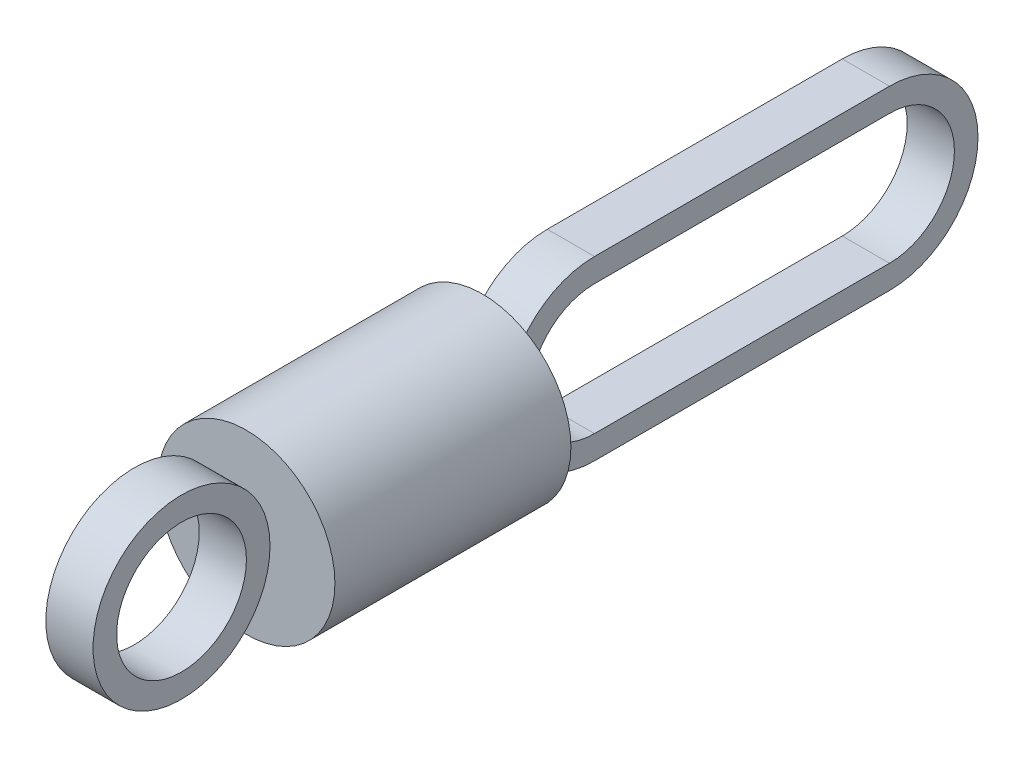
ISO-10303-21;
HEADER;
FILE_DESCRIPTION(('STEP AP214'),'2;1');
FILE_NAME('part.step','',(''),(''),'','','');
FILE_SCHEMA(('AUTOMOTIVE_DESIGN { 1 0 10303 214 1 1 1 1 }'));
ENDSEC;
DATA;
#1=APPLICATION_CONTEXT('core data for automotive mechanical design processes');
#2=APPLICATION_PROTOCOL_DEFINITION('international standard','automotive_design',2000,#1);
#3=PRODUCT_CONTEXT('',#1,'mechanical');
#4=PRODUCT('Part','Part','',(#3));
#5=PRODUCT_RELATED_PRODUCT_CATEGORY('part','',(#4));
#6=PRODUCT_DEFINITION_FORMATION('','',#4);
#7=PRODUCT_DEFINITION_CONTEXT('part definition',#1,'design');
#8=PRODUCT_DEFINITION('design','',#6,#7);
#9=PRODUCT_DEFINITION_SHAPE('','',#8);
#10=(LENGTH_UNIT() NAMED_UNIT(*) SI_UNIT(.MILLI.,.METRE.));
#11=(NAMED_UNIT(*) PLANE_ANGLE_UNIT() SI_UNIT($,.RADIAN.));
#12=(NAMED_UNIT(*) SI_UNIT($,.STERADIAN.) SOLID_ANGLE_UNIT());
#13=UNCERTAINTY_MEASURE_WITH_UNIT(LENGTH_MEASURE(1.E-05),#10,'distance_accuracy_value','');
#14=(GEOMETRIC_REPRESENTATION_CONTEXT(3) GLOBAL_UNCERTAINTY_ASSIGNED_CONTEXT((#13)) GLOBAL_UNIT_ASSIGNED_CONTEXT((#10,
#11,#12)) REPRESENTATION_CONTEXT('',''));
#15=CARTESIAN_POINT('',(0.,0.,0.));
#16=DIRECTION('',(0.,0.,1.));
#17=DIRECTION('',(1.,0.,0.));
#18=AXIS2_PLACEMENT_3D('',#15,#16,#17);
#19=CARTESIAN_POINT('',(0.,0.,-11.));
#20=DIRECTION('',(0.,0.,1.));
#21=DIRECTION('',(1.,0.,0.));
#22=AXIS2_PLACEMENT_3D('',#19,#20,#21);
#23=CYLINDRICAL_SURFACE('',#22,3.);
#24=CARTESIAN_POINT('',(0.,0.,-11.));
#25=DIRECTION('',(0.,0.,1.));
#26=DIRECTION('',(1.,0.,0.));
#27=AXIS2_PLACEMENT_3D('',#24,#25,#26);
#28=CIRCLE('',#27,3.);
#29=CARTESIAN_POINT('',(3.,0.,-11.));
#30=VERTEX_POINT('',#29);
#31=EDGE_CURVE('E11',#30,#30,#28,.T.);
#32=ORIENTED_EDGE('',*,*,#31,.T.);
#33=EDGE_LOOP('',(#32));
#34=FACE_BOUND('',#33,.T.);
#35=CARTESIAN_POINT('',(0.,0.,-3.));
#36=DIRECTION('',(0.,0.,1.));
#37=DIRECTION('',(1.,0.,0.));
#38=AXIS2_PLACEMENT_3D('',#35,#36,#37);
#39=CIRCLE('',#38,3.);
#40=CARTESIAN_POINT('',(3.,0.,-3.));
#41=VERTEX_POINT('',#40);
#42=EDGE_CURVE('E46',#41,#41,#39,.T.);
#43=ORIENTED_EDGE('',*,*,#42,.F.);
#44=EDGE_LOOP('',(#43));
#45=FACE_BOUND('',#44,.T.);
#46=ADVANCED_FACE('F43',(#34,#45),#23,.T.);
#47=CARTESIAN_POINT('',(0.,0.,-11.));
#48=DIRECTION('',(0.,0.,1.));
#49=DIRECTION('',(1.,0.,0.));
#50=AXIS2_PLACEMENT_3D('',#47,#48,#49);
#51=PLANE('',#50);
#52=ORIENTED_EDGE('',*,*,#31,.F.);
#53=EDGE_LOOP('',(#52));
#54=FACE_BOUND('',#53,.T.);
#55=ADVANCED_FACE('F58',(#54),#51,.F.);
#56=CARTESIAN_POINT('',(0.,0.,-3.));
#57=DIRECTION('',(0.,0.,1.));
#58=DIRECTION('',(1.,0.,0.));
#59=AXIS2_PLACEMENT_3D('',#56,#57,#58);
#60=PLANE('',#59);
#61=ORIENTED_EDGE('',*,*,#42,.T.);
#62=EDGE_LOOP('',(#61));
#63=FACE_BOUND('',#62,.T.);
#64=ADVANCED_FACE('F55',(#63),#60,.T.);
#65=CLOSED_SHELL('',(#46,#55,#64));
#66=MANIFOLD_SOLID_BREP('B2',#65);
#67=CARTESIAN_POINT('',(-0.8,0.,-24.));
#68=DIRECTION('',(1.,0.,0.));
#69=DIRECTION('',(0.,0.,-1.));
#70=AXIS2_PLACEMENT_3D('',#67,#68,#69);
#71=CYLINDRICAL_SURFACE('',#70,3.);
#72=DIRECTION('',(1.,0.,0.));
#73=VECTOR('',#72,1.);
#74=CARTESIAN_POINT('',(-0.8,3.,-24.));
#75=LINE('',#74,#73);
#76=CARTESIAN_POINT('',(-0.8,3.,-24.));
#77=VERTEX_POINT('',#76);
#78=CARTESIAN_POINT('',(0.8,3.,-24.));
#79=VERTEX_POINT('',#78);
#80=EDGE_CURVE('E94',#77,#79,#75,.T.);
#81=ORIENTED_EDGE('',*,*,#80,.T.);
#82=CARTESIAN_POINT('',(0.8,0.,-24.));
#83=DIRECTION('',(1.,0.,0.));
#84=DIRECTION('',(0.,0.,-1.));
#85=AXIS2_PLACEMENT_3D('',#82,#83,#84);
#86=CIRCLE('',#85,3.);
#87=CARTESIAN_POINT('',(0.8,-3.,-24.));
#88=VERTEX_POINT('',#87);
#89=EDGE_CURVE('E170',#88,#79,#86,.T.);
#90=ORIENTED_EDGE('',*,*,#89,.F.);
#91=DIRECTION('',(1.,0.,0.));
#92=VECTOR('',#91,1.);
#93=CARTESIAN_POINT('',(-0.8,-3.,-24.));
#94=LINE('',#93,#92);
#95=CARTESIAN_POINT('',(-0.8,-3.,-24.));
#96=VERTEX_POINT('',#95);
#97=EDGE_CURVE('E41',#96,#88,#94,.T.);
#98=ORIENTED_EDGE('',*,*,#97,.F.);
#99=CARTESIAN_POINT('',(-0.8,0.,-24.));
#100=DIRECTION('',(1.,0.,0.));
#101=DIRECTION('',(0.,0.,-1.));
#102=AXIS2_PLACEMENT_3D('',#99,#100,#101);
#103=CIRCLE('',#102,3.);
#104=EDGE_CURVE('E203',#96,#77,#103,.T.);
#105=ORIENTED_EDGE('',*,*,#104,.T.);
#106=EDGE_LOOP('',(#81,#90,#98,#105));
#107=FACE_BOUND('',#106,.T.);
#108=ADVANCED_FACE('F91',(#107),#71,.T.);
#109=CARTESIAN_POINT('',(-0.8,-3.,-24.));
#110=DIRECTION('',(0.,-1.,0.));
#111=DIRECTION('',(0.,0.,-1.));
#112=AXIS2_PLACEMENT_3D('',#109,#110,#111);
#113=PLANE('',#112);
#114=ORIENTED_EDGE('',*,*,#97,.T.);
#115=DIRECTION('',(0.,0.,-1.));
#116=VECTOR('',#115,1.);
#117=CARTESIAN_POINT('',(0.8,-3.,-24.));
#118=LINE('',#117,#116);
#119=CARTESIAN_POINT('',(0.8,-3.,-14.));
#120=VERTEX_POINT('',#119);
#121=EDGE_CURVE('E200',#120,#88,#118,.T.);
#122=ORIENTED_EDGE('',*,*,#121,.F.);
#123=DIRECTION('',(1.,0.,0.));
#124=VECTOR('',#123,1.);
#125=CARTESIAN_POINT('',(-0.8,-3.,-14.));
#126=LINE('',#125,#124);
#127=CARTESIAN_POINT('',(-0.8,-3.,-14.));
#128=VERTEX_POINT('',#127);
#129=EDGE_CURVE('E99',#128,#120,#126,.T.);
#130=ORIENTED_EDGE('',*,*,#129,.F.);
#131=DIRECTION('',(0.,0.,-1.));
#132=VECTOR('',#131,1.);
#133=CARTESIAN_POINT('',(-0.8,-3.,-24.));
#134=LINE('',#133,#132);
#135=EDGE_CURVE('E211',#128,#96,#134,.T.);
#136=ORIENTED_EDGE('',*,*,#135,.T.);
#137=EDGE_LOOP('',(#114,#122,#130,#136));
#138=FACE_BOUND('',#137,.T.);
#139=ADVANCED_FACE('F229',(#138),#113,.T.);
#140=CARTESIAN_POINT('',(-0.8,0.,-14.));
#141=DIRECTION('',(1.,0.,0.));
#142=DIRECTION('',(0.,0.,-1.));
#143=AXIS2_PLACEMENT_3D('',#140,#141,#142);
#144=CYLINDRICAL_SURFACE('',#143,3.);
#145=CARTESIAN_POINT('',(-0.8,0.,-14.));
#146=DIRECTION('',(1.,0.,0.));
#147=DIRECTION('',(0.,0.,-1.));
#148=AXIS2_PLACEMENT_3D('',#145,#146,#147);
#149=CIRCLE('',#148,3.);
#150=CARTESIAN_POINT('',(-0.8,3.,-14.));
#151=VERTEX_POINT('',#150);
#152=EDGE_CURVE('E209',#151,#128,#149,.T.);
#153=ORIENTED_EDGE('',*,*,#152,.T.);
#154=ORIENTED_EDGE('',*,*,#129,.T.);
#155=CARTESIAN_POINT('',(0.8,0.,-14.));
#156=DIRECTION('',(1.,0.,0.));
#157=DIRECTION('',(0.,0.,-1.));
#158=AXIS2_PLACEMENT_3D('',#155,#156,#157);
#159=CIRCLE('',#158,3.);
#160=CARTESIAN_POINT('',(0.8,3.,-14.));
#161=VERTEX_POINT('',#160);
#162=EDGE_CURVE('E198',#161,#120,#159,.T.);
#163=ORIENTED_EDGE('',*,*,#162,.F.);
#164=DIRECTION('',(1.,0.,0.));
#165=VECTOR('',#164,1.);
#166=CARTESIAN_POINT('',(-0.8,3.,-14.));
#167=LINE('',#166,#165);
#168=EDGE_CURVE('E215',#151,#161,#167,.T.);
#169=ORIENTED_EDGE('',*,*,#168,.F.);
#170=EDGE_LOOP('',(#153,#154,#163,#169));
#171=FACE_BOUND('',#170,.T.);
#172=ADVANCED_FACE('F233',(#171),#144,.T.);
#173=CARTESIAN_POINT('',(-0.8,3.,-24.));
#174=DIRECTION('',(0.,1.,0.));
#175=DIRECTION('',(0.,0.,1.));
#176=AXIS2_PLACEMENT_3D('',#173,#174,#175);
#177=PLANE('',#176);
#178=ORIENTED_EDGE('',*,*,#168,.T.);
#179=DIRECTION('',(0.,0.,1.));
#180=VECTOR('',#179,1.);
#181=CARTESIAN_POINT('',(0.8,3.,-24.));
#182=LINE('',#181,#180);
#183=EDGE_CURVE('E195',#79,#161,#182,.T.);
#184=ORIENTED_EDGE('',*,*,#183,.F.);
#185=ORIENTED_EDGE('',*,*,#80,.F.);
#186=DIRECTION('',(0.,0.,1.));
#187=VECTOR('',#186,1.);
#188=CARTESIAN_POINT('',(-0.8,3.,-24.));
#189=LINE('',#188,#187);
#190=EDGE_CURVE('E206',#77,#151,#189,.T.);
#191=ORIENTED_EDGE('',*,*,#190,.T.);
#192=EDGE_LOOP('',(#178,#184,#185,#191));
#193=FACE_BOUND('',#192,.T.);
#194=ADVANCED_FACE('F222',(#193),#177,.T.);
#195=CARTESIAN_POINT('',(-0.8,0.,-24.));
#196=DIRECTION('',(1.,0.,0.));
#197=DIRECTION('',(0.,0.,-1.));
#198=AXIS2_PLACEMENT_3D('',#195,#196,#197);
#199=PLANE('',#198);
#200=DIRECTION('',(0.,0.,1.));
#201=VECTOR('',#200,1.);
#202=CARTESIAN_POINT('',(-0.8,-2.2,-24.));
#203=LINE('',#202,#201);
#204=CARTESIAN_POINT('',(-0.8,-2.2,-24.));
#205=VERTEX_POINT('',#204);
#206=CARTESIAN_POINT('',(-0.8,-2.2,-14.));
#207=VERTEX_POINT('',#206);
#208=EDGE_CURVE('E176',#205,#207,#203,.T.);
#209=ORIENTED_EDGE('',*,*,#208,.F.);
#210=CARTESIAN_POINT('',(-0.8,0.,-24.));
#211=DIRECTION('',(1.,0.,0.));
#212=DIRECTION('',(0.,0.,-1.));
#213=AXIS2_PLACEMENT_3D('',#210,#211,#212);
#214=CIRCLE('',#213,2.2);
#215=CARTESIAN_POINT('',(-0.8,2.2,-24.));
#216=VERTEX_POINT('',#215);
#217=EDGE_CURVE('E158',#216,#205,#214,.F.);
#218=ORIENTED_EDGE('',*,*,#217,.F.);
#219=DIRECTION('',(0.,0.,-1.));
#220=VECTOR('',#219,1.);
#221=CARTESIAN_POINT('',(-0.8,2.2,-24.));
#222=LINE('',#221,#220);
#223=CARTESIAN_POINT('',(-0.8,2.2,-14.));
#224=VERTEX_POINT('',#223);
#225=EDGE_CURVE('E167',#224,#216,#222,.T.);
#226=ORIENTED_EDGE('',*,*,#225,.F.);
#227=CARTESIAN_POINT('',(-0.8,0.,-14.));
#228=DIRECTION('',(1.,0.,0.));
#229=DIRECTION('',(0.,0.,-1.));
#230=AXIS2_PLACEMENT_3D('',#227,#228,#229);
#231=CIRCLE('',#230,2.2);
#232=EDGE_CURVE('E107',#207,#224,#231,.F.);
#233=ORIENTED_EDGE('',*,*,#232,.F.);
#234=EDGE_LOOP('',(#209,#218,#226,#233));
#235=FACE_BOUND('',#234,.T.);
#236=ORIENTED_EDGE('',*,*,#104,.F.);
#237=ORIENTED_EDGE('',*,*,#135,.F.);
#238=ORIENTED_EDGE('',*,*,#152,.F.);
#239=ORIENTED_EDGE('',*,*,#190,.F.);
#240=EDGE_LOOP('',(#236,#237,#238,#239));
#241=FACE_BOUND('',#240,.T.);
#242=ADVANCED_FACE('F173',(#235,#241),#199,.F.);
#243=CARTESIAN_POINT('',(0.8,0.,-24.));
#244=DIRECTION('',(1.,0.,0.));
#245=DIRECTION('',(0.,0.,-1.));
#246=AXIS2_PLACEMENT_3D('',#243,#244,#245);
#247=PLANE('',#246);
#248=CARTESIAN_POINT('',(0.8,0.,-24.));
#249=DIRECTION('',(1.,0.,0.));
#250=DIRECTION('',(0.,0.,-1.));
#251=AXIS2_PLACEMENT_3D('',#248,#249,#250);
#252=CIRCLE('',#251,2.2);
#253=CARTESIAN_POINT('',(0.8,-2.2,-24.));
#254=VERTEX_POINT('',#253);
#255=CARTESIAN_POINT('',(0.8,2.2,-24.));
#256=VERTEX_POINT('',#255);
#257=EDGE_CURVE('E115',#254,#256,#252,.T.);
#258=ORIENTED_EDGE('',*,*,#257,.F.);
#259=DIRECTION('',(0.,0.,-1.));
#260=VECTOR('',#259,1.);
#261=CARTESIAN_POINT('',(0.8,-2.2,-24.));
#262=LINE('',#261,#260);
#263=CARTESIAN_POINT('',(0.8,-2.2,-14.));
#264=VERTEX_POINT('',#263);
#265=EDGE_CURVE('E164',#264,#254,#262,.T.);
#266=ORIENTED_EDGE('',*,*,#265,.F.);
#267=CARTESIAN_POINT('',(0.8,0.,-14.));
#268=DIRECTION('',(1.,0.,0.));
#269=DIRECTION('',(0.,0.,-1.));
#270=AXIS2_PLACEMENT_3D('',#267,#268,#269);
#271=CIRCLE('',#270,2.2);
#272=CARTESIAN_POINT('',(0.8,2.2,-14.));
#273=VERTEX_POINT('',#272);
#274=EDGE_CURVE('E184',#273,#264,#271,.T.);
#275=ORIENTED_EDGE('',*,*,#274,.F.);
#276=DIRECTION('',(0.,0.,1.));
#277=VECTOR('',#276,1.);
#278=CARTESIAN_POINT('',(0.8,2.2,-24.));
#279=LINE('',#278,#277);
#280=EDGE_CURVE('E178',#256,#273,#279,.T.);
#281=ORIENTED_EDGE('',*,*,#280,.F.);
#282=EDGE_LOOP('',(#258,#266,#275,#281));
#283=FACE_BOUND('',#282,.T.);
#284=ORIENTED_EDGE('',*,*,#89,.T.);
#285=ORIENTED_EDGE('',*,*,#183,.T.);
#286=ORIENTED_EDGE('',*,*,#162,.T.);
#287=ORIENTED_EDGE('',*,*,#121,.T.);
#288=EDGE_LOOP('',(#284,#285,#286,#287));
#289=FACE_BOUND('',#288,.T.);
#290=ADVANCED_FACE('F225',(#283,#289),#247,.T.);
#291=CARTESIAN_POINT('',(-0.801,0.,-24.));
#292=DIRECTION('',(1.,0.,0.));
#293=DIRECTION('',(0.,0.,-1.));
#294=AXIS2_PLACEMENT_3D('',#291,#292,#293);
#295=CYLINDRICAL_SURFACE('',#294,2.2);
#296=ORIENTED_EDGE('',*,*,#217,.T.);
#297=DIRECTION('',(1.,0.,0.));
#298=VECTOR('',#297,1.);
#299=CARTESIAN_POINT('',(-0.801,-2.2,-24.));
#300=LINE('',#299,#298);
#301=EDGE_CURVE('E171',#205,#254,#300,.T.);
#302=ORIENTED_EDGE('',*,*,#301,.T.);
#303=ORIENTED_EDGE('',*,*,#257,.T.);
#304=DIRECTION('',(1.,0.,0.));
#305=VECTOR('',#304,1.);
#306=CARTESIAN_POINT('',(-0.801,2.2,-24.));
#307=LINE('',#306,#305);
#308=EDGE_CURVE('E154',#216,#256,#307,.T.);
#309=ORIENTED_EDGE('',*,*,#308,.F.);
#310=EDGE_LOOP('',(#296,#302,#303,#309));
#311=FACE_BOUND('',#310,.T.);
#312=ADVANCED_FACE('F156',(#311),#295,.F.);
#313=CARTESIAN_POINT('',(-0.801,-2.2,-24.));
#314=DIRECTION('',(0.,-1.,0.));
#315=DIRECTION('',(0.,0.,-1.));
#316=AXIS2_PLACEMENT_3D('',#313,#314,#315);
#317=PLANE('',#316);
#318=ORIENTED_EDGE('',*,*,#208,.T.);
#319=DIRECTION('',(1.,0.,0.));
#320=VECTOR('',#319,1.);
#321=CARTESIAN_POINT('',(-0.801,-2.2,-14.));
#322=LINE('',#321,#320);
#323=EDGE_CURVE('E190',#207,#264,#322,.T.);
#324=ORIENTED_EDGE('',*,*,#323,.T.);
#325=ORIENTED_EDGE('',*,*,#265,.T.);
#326=ORIENTED_EDGE('',*,*,#301,.F.);
#327=EDGE_LOOP('',(#318,#324,#325,#326));
#328=FACE_BOUND('',#327,.T.);
#329=ADVANCED_FACE('F265',(#328),#317,.F.);
#330=CARTESIAN_POINT('',(-0.801,0.,-14.));
#331=DIRECTION('',(1.,0.,0.));
#332=DIRECTION('',(0.,0.,-1.));
#333=AXIS2_PLACEMENT_3D('',#330,#331,#332);
#334=CYLINDRICAL_SURFACE('',#333,2.2);
#335=ORIENTED_EDGE('',*,*,#232,.T.);
#336=DIRECTION('',(1.,0.,0.));
#337=VECTOR('',#336,1.);
#338=CARTESIAN_POINT('',(-0.801,2.2,-14.));
#339=LINE('',#338,#337);
#340=EDGE_CURVE('E163',#224,#273,#339,.T.);
#341=ORIENTED_EDGE('',*,*,#340,.T.);
#342=ORIENTED_EDGE('',*,*,#274,.T.);
#343=ORIENTED_EDGE('',*,*,#323,.F.);
#344=EDGE_LOOP('',(#335,#341,#342,#343));
#345=FACE_BOUND('',#344,.T.);
#346=ADVANCED_FACE('F276',(#345),#334,.F.);
#347=CARTESIAN_POINT('',(-0.801,2.2,-24.));
#348=DIRECTION('',(0.,1.,0.));
#349=DIRECTION('',(0.,0.,1.));
#350=AXIS2_PLACEMENT_3D('',#347,#348,#349);
#351=PLANE('',#350);
#352=ORIENTED_EDGE('',*,*,#225,.T.);
#353=ORIENTED_EDGE('',*,*,#308,.T.);
#354=ORIENTED_EDGE('',*,*,#280,.T.);
#355=ORIENTED_EDGE('',*,*,#340,.F.);
#356=EDGE_LOOP('',(#352,#353,#354,#355));
#357=FACE_BOUND('',#356,.T.);
#358=ADVANCED_FACE('F168',(#357),#351,.F.);
#359=CLOSED_SHELL('',(#108,#139,#172,#194,#242,#290,#312,#329,#346,#358));
#360=MANIFOLD_SOLID_BREP('B6',#359);
#361=CARTESIAN_POINT('',(-0.8,0.,0.));
#362=DIRECTION('',(1.,0.,0.));
#363=DIRECTION('',(0.,0.,-1.));
#364=AXIS2_PLACEMENT_3D('',#361,#362,#363);
#365=CYLINDRICAL_SURFACE('',#364,3.);
#366=CARTESIAN_POINT('',(-0.8,0.,0.));
#367=DIRECTION('',(1.,0.,0.));
#368=DIRECTION('',(0.,0.,-1.));
#369=AXIS2_PLACEMENT_3D('',#366,#367,#368);
#370=CIRCLE('',#369,3.);
#371=CARTESIAN_POINT('',(-0.8,0.,-3.));
#372=VERTEX_POINT('',#371);
#373=EDGE_CURVE('E90',#372,#372,#370,.T.);
#374=ORIENTED_EDGE('',*,*,#373,.T.);
#375=EDGE_LOOP('',(#374));
#376=FACE_BOUND('',#375,.T.);
#377=CARTESIAN_POINT('',(0.8,0.,0.));
#378=DIRECTION('',(1.,0.,0.));
#379=DIRECTION('',(0.,0.,-1.));
#380=AXIS2_PLACEMENT_3D('',#377,#378,#379);
#381=CIRCLE('',#380,3.);
#382=CARTESIAN_POINT('',(0.8,0.,-3.));
#383=VERTEX_POINT('',#382);
#384=EDGE_CURVE('E320',#383,#383,#381,.T.);
#385=ORIENTED_EDGE('',*,*,#384,.F.);
#386=EDGE_LOOP('',(#385));
#387=FACE_BOUND('',#386,.T.);
#388=ADVANCED_FACE('F314',(#376,#387),#365,.T.);
#389=CARTESIAN_POINT('',(-0.8,0.,0.));
#390=DIRECTION('',(1.,0.,0.));
#391=DIRECTION('',(0.,0.,-1.));
#392=AXIS2_PLACEMENT_3D('',#389,#390,#391);
#393=PLANE('',#392);
#394=CARTESIAN_POINT('',(-0.8,0.,0.));
#395=DIRECTION('',(1.,0.,0.));
#396=DIRECTION('',(0.,0.,-1.));
#397=AXIS2_PLACEMENT_3D('',#394,#395,#396);
#398=CIRCLE('',#397,2.2);
#399=CARTESIAN_POINT('',(-0.8,0.,-2.2));
#400=VERTEX_POINT('',#399);
#401=EDGE_CURVE('E324',#400,#400,#398,.F.);
#402=ORIENTED_EDGE('',*,*,#401,.F.);
#403=EDGE_LOOP('',(#402));
#404=FACE_BOUND('',#403,.T.);
#405=ORIENTED_EDGE('',*,*,#373,.F.);
#406=EDGE_LOOP('',(#405));
#407=FACE_BOUND('',#406,.T.);
#408=ADVANCED_FACE('F339',(#404,#407),#393,.F.);
#409=CARTESIAN_POINT('',(0.8,0.,0.));
#410=DIRECTION('',(1.,0.,0.));
#411=DIRECTION('',(0.,0.,-1.));
#412=AXIS2_PLACEMENT_3D('',#409,#410,#411);
#413=PLANE('',#412);
#414=CARTESIAN_POINT('',(0.8,0.,0.));
#415=DIRECTION('',(1.,0.,0.));
#416=DIRECTION('',(0.,0.,-1.));
#417=AXIS2_PLACEMENT_3D('',#414,#415,#416);
#418=CIRCLE('',#417,2.2);
#419=CARTESIAN_POINT('',(0.8,0.,-2.2));
#420=VERTEX_POINT('',#419);
#421=EDGE_CURVE('E328',#420,#420,#418,.T.);
#422=ORIENTED_EDGE('',*,*,#421,.F.);
#423=EDGE_LOOP('',(#422));
#424=FACE_BOUND('',#423,.T.);
#425=ORIENTED_EDGE('',*,*,#384,.T.);
#426=EDGE_LOOP('',(#425));
#427=FACE_BOUND('',#426,.T.);
#428=ADVANCED_FACE('F337',(#424,#427),#413,.T.);
#429=CARTESIAN_POINT('',(-0.801,0.,0.));
#430=DIRECTION('',(1.,0.,0.));
#431=DIRECTION('',(0.,0.,-1.));
#432=AXIS2_PLACEMENT_3D('',#429,#430,#431);
#433=CYLINDRICAL_SURFACE('',#432,2.2);
#434=ORIENTED_EDGE('',*,*,#421,.T.);
#435=EDGE_LOOP('',(#434));
#436=FACE_BOUND('',#435,.T.);
#437=ORIENTED_EDGE('',*,*,#401,.T.);
#438=EDGE_LOOP('',(#437));
#439=FACE_BOUND('',#438,.T.);
#440=ADVANCED_FACE('F334',(#436,#439),#433,.F.);
#441=CLOSED_SHELL('',(#388,#408,#428,#440));
#442=MANIFOLD_SOLID_BREP('B35',#441);
#443=ADVANCED_BREP_SHAPE_REPRESENTATION('',(#18,#66,#360,#442),#14);
#444=SHAPE_DEFINITION_REPRESENTATION(#9,#443);
ENDSEC;
END-ISO-10303-21;
